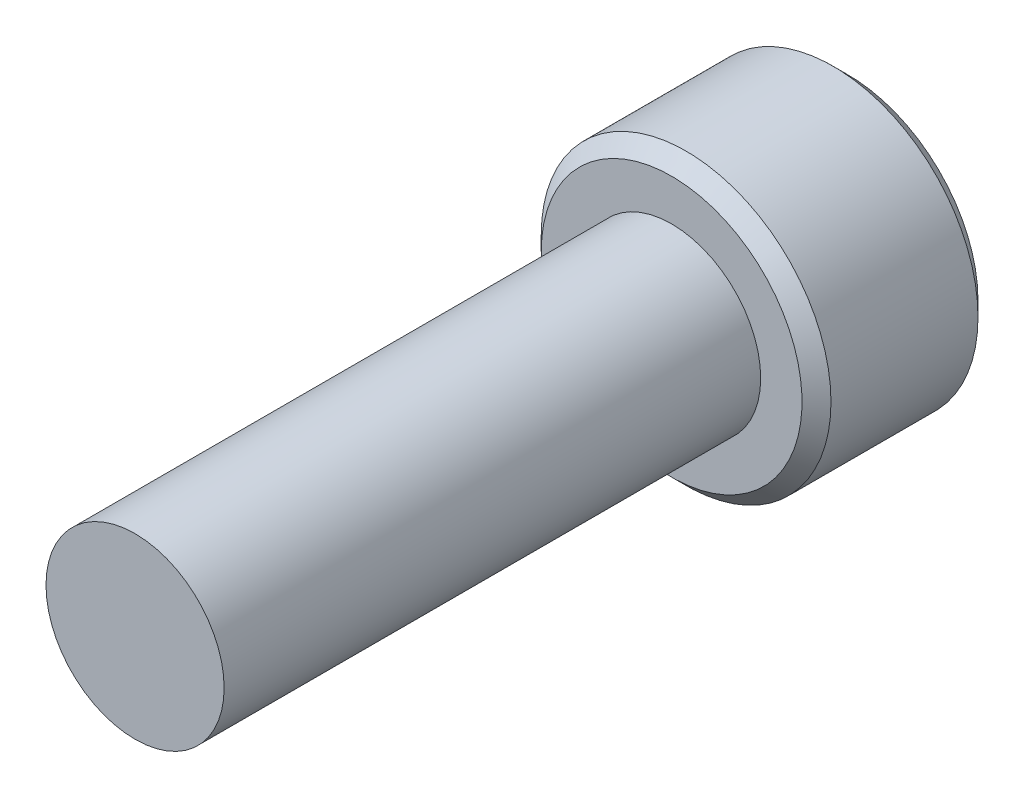
ISO-10303-21;
HEADER;
FILE_DESCRIPTION(('STEP AP214'),'2;1');
FILE_NAME('part.step','',(''),(''),'','','');
FILE_SCHEMA(('AUTOMOTIVE_DESIGN { 1 0 10303 214 1 1 1 1 }'));
ENDSEC;
DATA;
#1=APPLICATION_CONTEXT('core data for automotive mechanical design processes');
#2=APPLICATION_PROTOCOL_DEFINITION('international standard','automotive_design',2000,#1);
#3=PRODUCT_CONTEXT('',#1,'mechanical');
#4=PRODUCT('Part','Part','',(#3));
#5=PRODUCT_RELATED_PRODUCT_CATEGORY('part','',(#4));
#6=PRODUCT_DEFINITION_FORMATION('','',#4);
#7=PRODUCT_DEFINITION_CONTEXT('part definition',#1,'design');
#8=PRODUCT_DEFINITION('design','',#6,#7);
#9=PRODUCT_DEFINITION_SHAPE('','',#8);
#10=(LENGTH_UNIT() NAMED_UNIT(*) SI_UNIT(.MILLI.,.METRE.));
#11=(NAMED_UNIT(*) PLANE_ANGLE_UNIT() SI_UNIT($,.RADIAN.));
#12=(NAMED_UNIT(*) SI_UNIT($,.STERADIAN.) SOLID_ANGLE_UNIT());
#13=UNCERTAINTY_MEASURE_WITH_UNIT(LENGTH_MEASURE(1.E-05),#10,'distance_accuracy_value','');
#14=(GEOMETRIC_REPRESENTATION_CONTEXT(3) GLOBAL_UNCERTAINTY_ASSIGNED_CONTEXT((#13)) GLOBAL_UNIT_ASSIGNED_CONTEXT((#10,
#11,#12)) REPRESENTATION_CONTEXT('',''));
#15=CARTESIAN_POINT('',(0.,0.,0.));
#16=DIRECTION('',(0.,0.,1.));
#17=DIRECTION('',(1.,0.,0.));
#18=AXIS2_PLACEMENT_3D('',#15,#16,#17);
#19=CARTESIAN_POINT('',(1.7859375,1.03111149638096,-14.18669375));
#20=DIRECTION('',(1.,0.,0.));
#21=DIRECTION('',(0.,0.,-1.));
#22=AXIS2_PLACEMENT_3D('',#19,#20,#21);
#23=PLANE('',#22);
#24=CARTESIAN_POINT('',(1.7859375,-1.03111149637937,-16.8656000000012));
#25=CARTESIAN_POINT('',(1.78593750000005,-0.960694923078708,-16.8304245653045));
#26=CARTESIAN_POINT('',(1.78593750000003,-0.889108487066364,-16.7973030292043));
#27=CARTESIAN_POINT('',(1.78593749999997,-0.743109337852341,-16.7365905845436));
#28=CARTESIAN_POINT('',(1.78593749999995,-0.668681444315399,-16.7090365045877));
#29=CARTESIAN_POINT('',(1.78593750000005,-0.517674563664478,-16.6614565305802));
#30=CARTESIAN_POINT('',(1.78593750000018,-0.441103823281961,-16.641405158756));
#31=CARTESIAN_POINT('',(1.78593749999982,-0.286283782117742,-16.6105352050181));
#32=CARTESIAN_POINT('',(1.78593749999935,-0.208040449591477,-16.5996880720765));
#33=CARTESIAN_POINT('',(1.78593750000018,-0.107926669463274,-16.5924419923813));
#34=CARTESIAN_POINT('',(1.78593750000044,-0.0863521599569167,-16.5912705280223));
#35=CARTESIAN_POINT('',(1.78593749999956,-0.0431861080384684,-16.5897066436704));
#36=CARTESIAN_POINT('',(1.78593749999841,-0.0215945812637418,-16.5893138004778));
#37=CARTESIAN_POINT('',(1.78593749999653,0.0541981545623382,-16.5893162810781));
#38=CARTESIAN_POINT('',(1.78593749999905,0.108415549697237,-16.5917970707003));
#39=CARTESIAN_POINT('',(1.78593750000095,0.216427473854891,-16.6015728961233));
#40=CARTESIAN_POINT('',(1.78593750000033,0.270221681438319,-16.6088712897456));
#41=CARTESIAN_POINT('',(1.78593749999934,0.430887377453098,-16.637536606517));
#42=CARTESIAN_POINT('',(1.78593749999985,0.536587945955721,-16.6656688034959));
#43=CARTESIAN_POINT('',(1.7859375000001,0.707329338606865,-16.7232200323221));
#44=CARTESIAN_POINT('',(1.78593750000005,0.773761148804478,-16.7488111199169));
#45=CARTESIAN_POINT('',(1.78593749999995,0.904109359625222,-16.8042752636258));
#46=CARTESIAN_POINT('',(1.7859374999999,0.968043209878489,-16.8341070137323));
#47=CARTESIAN_POINT('',(1.7859375,1.03111149637934,-16.8656000000012));
#48=B_SPLINE_CURVE_WITH_KNOTS('',3,(#24,#25,#26,#27,#28,#29,#30,#31,#32,#33,#34,#35,#36,#37,#38,
#39,#40,#41,#42,#43,#44,#45,#46,#47),.UNSPECIFIED.,.F.,.F.,(4,2,2,2,2,2,2,2,2,2,2,4),(0.,
0.236303104653081,0.474121562186736,0.711124941864045,0.947390434622098,1.01219957256711,
1.07697347548168,1.23954324050254,1.40222643482151,1.72893676569651,1.94237217076301,
2.15385538568802),.UNSPECIFIED.);
#49=CARTESIAN_POINT('',(1.7859375,-1.03111149638017,-16.86560000003));
#50=VERTEX_POINT('',#49);
#51=CARTESIAN_POINT('',(1.78593749998182,1.03111149637042,-16.8656000000378));
#52=VERTEX_POINT('',#51);
#53=EDGE_CURVE('E20',#50,#52,#48,.T.);
#54=ORIENTED_EDGE('',*,*,#53,.F.);
#55=DIRECTION('',(0.,0.,1.));
#56=VECTOR('',#55,1.);
#57=CARTESIAN_POINT('',(1.7859375,-1.03111149638096,-14.18669375));
#58=LINE('',#57,#56);
#59=CARTESIAN_POINT('',(1.7859375,-1.03111149638096,-14.18669375));
#60=VERTEX_POINT('',#59);
#61=EDGE_CURVE('E82',#50,#60,#58,.T.);
#62=ORIENTED_EDGE('',*,*,#61,.T.);
#63=DIRECTION('',(0.,1.,0.));
#64=VECTOR('',#63,1.);
#65=CARTESIAN_POINT('',(1.7859375,3.09333448914288,-14.18669375));
#66=LINE('',#65,#64);
#67=CARTESIAN_POINT('',(1.78593749999995,1.03111149638087,-14.18669375));
#68=VERTEX_POINT('',#67);
#69=EDGE_CURVE('E85',#68,#60,#66,.F.);
#70=ORIENTED_EDGE('',*,*,#69,.F.);
#71=DIRECTION('',(0.,0.,1.));
#72=VECTOR('',#71,1.);
#73=CARTESIAN_POINT('',(1.78593749999992,1.03111149638082,-14.18669375));
#74=LINE('',#73,#72);
#75=EDGE_CURVE('E268',#68,#52,#74,.F.);
#76=ORIENTED_EDGE('',*,*,#75,.T.);
#77=EDGE_LOOP('',(#54,#62,#70,#76));
#78=FACE_BOUND('',#77,.T.);
#79=ADVANCED_FACE('F16',(#78),#23,.F.);
#80=CARTESIAN_POINT('',(-1.7859375,-1.03111149638096,-14.18669375));
#81=DIRECTION('',(-1.,0.,0.));
#82=DIRECTION('',(0.,0.,1.));
#83=AXIS2_PLACEMENT_3D('',#80,#81,#82);
#84=PLANE('',#83);
#85=CARTESIAN_POINT('',(-1.78593750000409,1.031111496355,-16.8656000000436));
#86=CARTESIAN_POINT('',(-1.78593750000151,0.960694923055193,-16.8304245653494));
#87=CARTESIAN_POINT('',(-1.78593750000041,0.88910848704405,-16.797303029251));
#88=CARTESIAN_POINT('',(-1.78593749999958,0.7431093378328,-16.7365905845932));
#89=CARTESIAN_POINT('',(-1.78593749999986,0.668681444297431,-16.7090365046383));
#90=CARTESIAN_POINT('',(-1.78593750000014,0.517674563649615,-16.6614565306329));
#91=CARTESIAN_POINT('',(-1.78593750000015,0.441103823268626,-16.6414051588097));
#92=CARTESIAN_POINT('',(-1.78593749999985,0.286283782107617,-16.6105352050734));
#93=CARTESIAN_POINT('',(-1.78593749999953,0.208040449583033,-16.5996880721323));
#94=CARTESIAN_POINT('',(-1.78593750000013,0.107926669457654,-16.5924419924378));
#95=CARTESIAN_POINT('',(-1.78593750000032,0.086352159952417,-16.591270528079));
#96=CARTESIAN_POINT('',(-1.78593749999968,0.0431861080362155,-16.5897066437272));
#97=CARTESIAN_POINT('',(-1.78593749999885,0.0215945812626152,-16.5893138005344));
#98=CARTESIAN_POINT('',(-1.7859374999975,-0.0541981545623212,-16.5893162811346));
#99=CARTESIAN_POINT('',(-1.78593749999932,-0.108415549697204,-16.591797070757));
#100=CARTESIAN_POINT('',(-1.78593750000068,-0.216427473854849,-16.6015728961803));
#101=CARTESIAN_POINT('',(-1.78593750000024,-0.270221681438286,-16.6088712898025));
#102=CARTESIAN_POINT('',(-1.78593749999952,-0.430887377453079,-16.6375366065738));
#103=CARTESIAN_POINT('',(-1.78593749999989,-0.536587945955707,-16.6656688035527));
#104=CARTESIAN_POINT('',(-1.78593750000007,-0.70732933860241,-16.7232200323774));
#105=CARTESIAN_POINT('',(-1.78593750000004,-0.773761148795714,-16.7488111199704));
#106=CARTESIAN_POINT('',(-1.78593749999996,-0.904109359608134,-16.804275263675));
#107=CARTESIAN_POINT('',(-1.78593749999993,-0.968043209857382,-16.8341070137791));
#108=CARTESIAN_POINT('',(-1.7859375,-1.03111149635433,-16.8656000000455));
#109=B_SPLINE_CURVE_WITH_KNOTS('',3,(#85,#86,#87,#88,#89,#90,#91,#92,#93,#94,#95,#96,#97,#98,
#99,#100,#101,#102,#103,#104,#105,#106,#107,#108),.UNSPECIFIED.,.F.,.F.,(4,2,2,2,2,2,2,2,2,2,2,
4),(0.,0.236303104647563,0.474121562175721,0.711124941847836,0.947390434600691,1.01219957254232,
1.07697347545353,1.23954324047434,1.40222643479334,1.72893676566835,1.9423721707208,
2.15385538563192),.UNSPECIFIED.);
#110=CARTESIAN_POINT('',(-1.78593749996372,1.03111149638848,-16.8656000000311));
#111=VERTEX_POINT('',#110);
#112=CARTESIAN_POINT('',(-1.78593749998182,-1.03111149637042,-16.8656000000378));
#113=VERTEX_POINT('',#112);
#114=EDGE_CURVE('E59',#111,#113,#109,.T.);
#115=ORIENTED_EDGE('',*,*,#114,.F.);
#116=DIRECTION('',(0.,0.,1.));
#117=VECTOR('',#116,1.);
#118=CARTESIAN_POINT('',(-1.7859375,1.03111149638096,-14.18669375));
#119=LINE('',#118,#117);
#120=CARTESIAN_POINT('',(-1.7859375,1.03111149638096,-14.18669375));
#121=VERTEX_POINT('',#120);
#122=EDGE_CURVE('E266',#111,#121,#119,.T.);
#123=ORIENTED_EDGE('',*,*,#122,.T.);
#124=DIRECTION('',(0.,1.,0.));
#125=VECTOR('',#124,1.);
#126=CARTESIAN_POINT('',(-1.7859375,3.09333448914288,-14.18669375));
#127=LINE('',#126,#125);
#128=CARTESIAN_POINT('',(-1.78593749999995,-1.03111149638087,-14.18669375));
#129=VERTEX_POINT('',#128);
#130=EDGE_CURVE('E99',#129,#121,#127,.T.);
#131=ORIENTED_EDGE('',*,*,#130,.F.);
#132=DIRECTION('',(0.,0.,1.));
#133=VECTOR('',#132,1.);
#134=CARTESIAN_POINT('',(-1.78593749999992,-1.03111149638082,-14.18669375));
#135=LINE('',#134,#133);
#136=EDGE_CURVE('E92',#129,#113,#135,.F.);
#137=ORIENTED_EDGE('',*,*,#136,.T.);
#138=EDGE_LOOP('',(#115,#123,#131,#137));
#139=FACE_BOUND('',#138,.T.);
#140=ADVANCED_FACE('F205',(#139),#84,.F.);
#141=CARTESIAN_POINT('',(1.7859375,3.09333448914288,-14.18669375));
#142=DIRECTION('',(0.,0.,-1.));
#143=DIRECTION('',(-1.,0.,0.));
#144=AXIS2_PLACEMENT_3D('',#141,#142,#143);
#145=PLANE('',#144);
#146=ORIENTED_EDGE('',*,*,#130,.T.);
#147=DIRECTION('',(-0.866025403784429,-0.500000000000017,0.));
#148=VECTOR('',#147,1.);
#149=CARTESIAN_POINT('',(-1.7859375,1.03111149638096,-14.18669375));
#150=LINE('',#149,#148);
#151=CARTESIAN_POINT('',(0.,2.06222299276178,-14.18669375));
#152=VERTEX_POINT('',#151);
#153=EDGE_CURVE('E68',#121,#152,#150,.F.);
#154=ORIENTED_EDGE('',*,*,#153,.T.);
#155=DIRECTION('',(-0.866025403784429,0.500000000000017,0.));
#156=VECTOR('',#155,1.);
#157=CARTESIAN_POINT('',(0.,2.06222299276167,-14.18669375));
#158=LINE('',#157,#156);
#159=EDGE_CURVE('E97',#152,#68,#158,.F.);
#160=ORIENTED_EDGE('',*,*,#159,.T.);
#161=ORIENTED_EDGE('',*,*,#69,.T.);
#162=DIRECTION('',(0.866025403784429,0.500000000000017,0.));
#163=VECTOR('',#162,1.);
#164=CARTESIAN_POINT('',(1.7859375,-1.03111149638096,-14.18669375));
#165=LINE('',#164,#163);
#166=CARTESIAN_POINT('',(0.,-2.06222299276178,-14.18669375));
#167=VERTEX_POINT('',#166);
#168=EDGE_CURVE('E91',#60,#167,#165,.F.);
#169=ORIENTED_EDGE('',*,*,#168,.T.);
#170=DIRECTION('',(0.866025403784429,-0.500000000000017,0.));
#171=VECTOR('',#170,1.);
#172=CARTESIAN_POINT('',(0.,-2.06222299276167,-14.18669375));
#173=LINE('',#172,#171);
#174=EDGE_CURVE('E279',#167,#129,#173,.F.);
#175=ORIENTED_EDGE('',*,*,#174,.T.);
#176=EDGE_LOOP('',(#146,#154,#160,#161,#169,#175));
#177=FACE_BOUND('',#176,.T.);
#178=ADVANCED_FACE('F94',(#177),#145,.T.);
#179=CARTESIAN_POINT('',(0.,-2.06222299276167,-14.18669375));
#180=DIRECTION('',(-0.500000000000017,-0.866025403784429,0.));
#181=DIRECTION('',(0.866025403784429,-0.500000000000017,0.));
#182=AXIS2_PLACEMENT_3D('',#179,#180,#181);
#183=PLANE('',#182);
#184=ORIENTED_EDGE('',*,*,#136,.F.);
#185=ORIENTED_EDGE('',*,*,#174,.F.);
#186=DIRECTION('',(0.,0.,1.));
#187=VECTOR('',#186,1.);
#188=CARTESIAN_POINT('',(0.,-2.06222299276181,-14.18669375));
#189=LINE('',#188,#187);
#190=CARTESIAN_POINT('',(0.,-2.06222299274083,-16.8656000000379));
#191=VERTEX_POINT('',#190);
#192=EDGE_CURVE('E103',#167,#191,#189,.F.);
#193=ORIENTED_EDGE('',*,*,#192,.T.);
#194=CARTESIAN_POINT('',(-2.52425246083631E-11,-2.06222299275114,-16.8656000000432));
#195=CARTESIAN_POINT('',(-0.0613835440644508,-2.0267831870737,-16.8301942051948));
#196=CARTESIAN_POINT('',(-0.123793422288812,-1.9907508270797,-16.7968681956716));
#197=CARTESIAN_POINT('',(-0.251053568630573,-1.91727714733139,-16.7358496949329));
#198=CARTESIAN_POINT('',(-0.315915932581498,-1.87982884404433,-16.7081911432972));
#199=CARTESIAN_POINT('',(-0.446707707791609,-1.80431617741919,-16.6608118581681));
#200=CARTESIAN_POINT('',(-0.512603828284567,-1.76627103451395,-16.6409720707712));
#201=CARTESIAN_POINT('',(-0.6458463698891,-1.68934341725101,-16.610405099807));
#202=CARTESIAN_POINT('',(-0.713188723557539,-1.65046329123269,-16.5996551077041));
#203=CARTESIAN_POINT('',(-0.829256370751006,-1.58345160388134,-16.5899555846295));
#204=CARTESIAN_POINT('',(-0.877831821101637,-1.5554065545454,-16.5885201744524));
#205=CARTESIAN_POINT('',(-0.974903249059068,-1.49936233948355,-16.5909415301668));
#206=CARTESIAN_POINT('',(-1.02339919284593,-1.47136319328359,-16.5948001510132));
#207=CARTESIAN_POINT('',(-1.11991972029757,-1.41563704077706,-16.6075882036147));
#208=CARTESIAN_POINT('',(-1.16794387251252,-1.38791028356816,-16.6165219039302));
#209=CARTESIAN_POINT('',(-1.26318834669003,-1.33292086076295,-16.6389751790974));
#210=CARTESIAN_POINT('',(-1.31040827497174,-1.30565842245839,-16.6524969357525));
#211=CARTESIAN_POINT('',(-1.43130969041198,-1.23585595770855,-16.6926243108538));
#212=CARTESIAN_POINT('',(-1.50424262479197,-1.19374810841147,-16.7222499206904));
#213=CARTESIAN_POINT('',(-1.61148491151358,-1.13183174530424,-16.7722605683855));
#214=CARTESIAN_POINT('',(-1.64682614895389,-1.11142747235458,-16.7898317844474));
#215=CARTESIAN_POINT('',(-1.71685424556421,-1.07099673192577,-16.8265757307161));
#216=CARTESIAN_POINT('',(-1.75154149001672,-1.05097004200367,-16.8457474794197));
#217=CARTESIAN_POINT('',(-1.785937499977,-1.03111149639405,-16.8656000000454));
#218=B_SPLINE_CURVE_WITH_KNOTS('',3,(#194,#195,#196,#197,#198,#199,#200,#201,#202,#203,#204,
#205,#206,#207,#208,#209,#210,#211,#212,#213,#214,#215,#216,#217),.UNSPECIFIED.,.F.,.F.,(4,2,2,
2,2,2,2,2,2,2,2,4),(0.,0.237856418652743,0.477098096699965,0.712541425839908,0.947392201526387,
1.11547935100692,1.28362541093116,1.45191310539068,1.62028093976164,1.88754436619542,
2.02081355604781,2.1540016125347),.UNSPECIFIED.);
#219=EDGE_CURVE('E189',#191,#113,#218,.T.);
#220=ORIENTED_EDGE('',*,*,#219,.T.);
#221=EDGE_LOOP('',(#184,#185,#193,#220));
#222=FACE_BOUND('',#221,.T.);
#223=ADVANCED_FACE('F198',(#222),#183,.F.);
#224=CARTESIAN_POINT('',(1.7859375,-1.03111149638096,-14.18669375));
#225=DIRECTION('',(0.500000000000017,-0.866025403784429,0.));
#226=DIRECTION('',(0.866025403784429,0.500000000000017,0.));
#227=AXIS2_PLACEMENT_3D('',#224,#225,#226);
#228=PLANE('',#227);
#229=ORIENTED_EDGE('',*,*,#192,.F.);
#230=ORIENTED_EDGE('',*,*,#168,.F.);
#231=ORIENTED_EDGE('',*,*,#61,.F.);
#232=CARTESIAN_POINT('',(1.78593749998766,-1.0311114964027,-16.8656000000411));
#233=CARTESIAN_POINT('',(1.72455395594179,-1.06655130207204,-16.8301942051949));
#234=CARTESIAN_POINT('',(1.66214407771442,-1.10258366206286,-16.7968681956725));
#235=CARTESIAN_POINT('',(1.53488393136976,-1.17605734180923,-16.7358496949339));
#236=CARTESIAN_POINT('',(1.47002156741897,-1.21350564509754,-16.7081911432977));
#237=CARTESIAN_POINT('',(1.33922979220818,-1.28901831172403,-16.660811858168));
#238=CARTESIAN_POINT('',(1.27333367171441,-1.32706345462939,-16.6409720707709));
#239=CARTESIAN_POINT('',(1.1400911301085,-1.40399107189288,-16.6104050998067));
#240=CARTESIAN_POINT('',(1.07274877643948,-1.44287119791163,-16.5996551077038));
#241=CARTESIAN_POINT('',(0.956681129245291,-1.50988288526344,-16.5899555846294));
#242=CARTESIAN_POINT('',(0.908105678894523,-1.53792793459945,-16.5885201744525));
#243=CARTESIAN_POINT('',(0.811034250936835,-1.59397214966144,-16.5909415301672));
#244=CARTESIAN_POINT('',(0.762538307149846,-1.62197129586147,-16.5948001510138));
#245=CARTESIAN_POINT('',(0.666017779697999,-1.67769744836812,-16.6075882036156));
#246=CARTESIAN_POINT('',(0.617993627482958,-1.70542420557708,-16.6165219039313));
#247=CARTESIAN_POINT('',(0.522749153305281,-1.76041362838239,-16.6389751790989));
#248=CARTESIAN_POINT('',(0.475529225023498,-1.78767606668699,-16.6524969357541));
#249=CARTESIAN_POINT('',(0.354627809584243,-1.85747853143625,-16.6926243108555));
#250=CARTESIAN_POINT('',(0.281694875205298,-1.89958638073273,-16.7222499206918));
#251=CARTESIAN_POINT('',(0.174452588485172,-1.96150274383911,-16.7722605683863));
#252=CARTESIAN_POINT('',(0.139111351045339,-1.98190701678849,-16.789831784448));
#253=CARTESIAN_POINT('',(0.0690832544359493,-2.02233775721676,-16.8265757307162));
#254=CARTESIAN_POINT('',(0.0343960099838948,-2.0423644471386,-16.8457474794195));
#255=CARTESIAN_POINT('',(2.40634388265502E-11,-2.06222299274796,-16.865600000045));
#256=B_SPLINE_CURVE_WITH_KNOTS('',3,(#232,#233,#234,#235,#236,#237,#238,#239,#240,#241,#242,
#243,#244,#245,#246,#247,#248,#249,#250,#251,#252,#253,#254,#255),.UNSPECIFIED.,.F.,.F.,(4,2,2,
2,2,2,2,2,2,2,2,4),(0.,0.237856418654608,0.477098096703912,0.712541425846054,0.94739220153464,
1.1154793510156,1.28362541094031,1.45191310540021,1.62028093977156,1.88754436620169,
2.02081355605231,2.15400161253744),.UNSPECIFIED.);
#257=EDGE_CURVE('E182',#50,#191,#256,.T.);
#258=ORIENTED_EDGE('',*,*,#257,.T.);
#259=EDGE_LOOP('',(#229,#230,#231,#258));
#260=FACE_BOUND('',#259,.T.);
#261=ADVANCED_FACE('F102',(#260),#228,.F.);
#262=CARTESIAN_POINT('',(0.,2.06222299276167,-14.18669375));
#263=DIRECTION('',(0.500000000000017,0.866025403784429,0.));
#264=DIRECTION('',(-0.866025403784429,0.500000000000017,0.));
#265=AXIS2_PLACEMENT_3D('',#262,#263,#264);
#266=PLANE('',#265);
#267=ORIENTED_EDGE('',*,*,#75,.F.);
#268=ORIENTED_EDGE('',*,*,#159,.F.);
#269=DIRECTION('',(0.,0.,1.));
#270=VECTOR('',#269,1.);
#271=CARTESIAN_POINT('',(0.,2.06222299276181,-14.18669375));
#272=LINE('',#271,#270);
#273=CARTESIAN_POINT('',(0.,2.06222299274083,-16.8656000000379));
#274=VERTEX_POINT('',#273);
#275=EDGE_CURVE('E40',#152,#274,#272,.F.);
#276=ORIENTED_EDGE('',*,*,#275,.T.);
#277=CARTESIAN_POINT('',(2.5242462771058E-11,2.06222299275114,-16.8656000000432));
#278=CARTESIAN_POINT('',(0.0613835440644523,2.0267831870737,-16.8301942051948));
#279=CARTESIAN_POINT('',(0.123793422288815,1.9907508270797,-16.7968681956716));
#280=CARTESIAN_POINT('',(0.251053568630583,1.91727714733138,-16.7358496949329));
#281=CARTESIAN_POINT('',(0.31591593258151,1.87982884404433,-16.7081911432972));
#282=CARTESIAN_POINT('',(0.446707707791621,1.80431617741918,-16.6608118581681));
#283=CARTESIAN_POINT('',(0.512603828284577,1.76627103451395,-16.6409720707712));
#284=CARTESIAN_POINT('',(0.645846369889104,1.68934341725101,-16.610405099807));
#285=CARTESIAN_POINT('',(0.713188723557541,1.65046329123269,-16.5996551077041));
#286=CARTESIAN_POINT('',(0.829256370751005,1.58345160388134,-16.5899555846295));
#287=CARTESIAN_POINT('',(0.877831821101636,1.5554065545454,-16.5885201744524));
#288=CARTESIAN_POINT('',(0.974903249059065,1.49936233948355,-16.5909415301668));
#289=CARTESIAN_POINT('',(1.02339919284593,1.4713631932836,-16.5948001510132));
#290=CARTESIAN_POINT('',(1.11991972029757,1.41563704077707,-16.6075882036147));
#291=CARTESIAN_POINT('',(1.16794387251252,1.38791028356816,-16.6165219039302));
#292=CARTESIAN_POINT('',(1.26318834669003,1.33292086076295,-16.6389751790974));
#293=CARTESIAN_POINT('',(1.31040827497174,1.30565842245839,-16.6524969357525));
#294=CARTESIAN_POINT('',(1.43130969041249,1.23585595770826,-16.692624310854));
#295=CARTESIAN_POINT('',(1.50424262479296,1.19374810841091,-16.7222499206908));
#296=CARTESIAN_POINT('',(1.61148491151526,1.13183174530327,-16.7722605683863));
#297=CARTESIAN_POINT('',(1.6468261489558,1.11142747235348,-16.7898317844484));
#298=CARTESIAN_POINT('',(1.71685424556657,1.07099673192441,-16.8265757307173));
#299=CARTESIAN_POINT('',(1.7515414900193,1.05097004200218,-16.8457474794211));
#300=CARTESIAN_POINT('',(1.7859374999798,1.03111149639244,-16.865600000047));
#301=B_SPLINE_CURVE_WITH_KNOTS('',3,(#277,#278,#279,#280,#281,#282,#283,#284,#285,#286,#287,
#288,#289,#290,#291,#292,#293,#294,#295,#296,#297,#298,#299,#300),.UNSPECIFIED.,.F.,.F.,(4,2,2,
2,2,2,2,2,2,2,2,4),(0.,0.237856418652751,0.477098096699982,0.712541425839917,0.947392201526388,
1.11547935100691,1.28362541093116,1.45191310539068,1.62028093976164,1.88754436619723,
2.02081355605051,2.1540016125383),.UNSPECIFIED.);
#302=EDGE_CURVE('E148',#274,#52,#301,.T.);
#303=ORIENTED_EDGE('',*,*,#302,.T.);
#304=EDGE_LOOP('',(#267,#268,#276,#303));
#305=FACE_BOUND('',#304,.T.);
#306=ADVANCED_FACE('F197',(#305),#266,.F.);
#307=CARTESIAN_POINT('',(-1.7859375,1.03111149638096,-14.18669375));
#308=DIRECTION('',(-0.500000000000017,0.866025403784429,0.));
#309=DIRECTION('',(-0.866025403784429,-0.500000000000017,0.));
#310=AXIS2_PLACEMENT_3D('',#307,#308,#309);
#311=PLANE('',#310);
#312=ORIENTED_EDGE('',*,*,#275,.F.);
#313=ORIENTED_EDGE('',*,*,#153,.F.);
#314=ORIENTED_EDGE('',*,*,#122,.F.);
#315=CARTESIAN_POINT('',(-1.78593749997956,1.03111149639748,-16.8656000000436));
#316=CARTESIAN_POINT('',(-1.72455395593779,1.06655130207079,-16.8301942051953));
#317=CARTESIAN_POINT('',(-1.66214407771234,1.1025836620631,-16.7968681956721));
#318=CARTESIAN_POINT('',(-1.53488393136968,1.17605734181024,-16.7358496949333));
#319=CARTESIAN_POINT('',(-1.47002156741896,1.2135056450978,-16.7081911432976));
#320=CARTESIAN_POINT('',(-1.33922979220889,1.28901831172337,-16.6608118581684));
#321=CARTESIAN_POINT('',(-1.27333367171577,1.32706345462854,-16.6409720707714));
#322=CARTESIAN_POINT('',(-1.14009113011102,1.40399107189149,-16.6104050998071));
#323=CARTESIAN_POINT('',(-1.07274877644251,1.44287119790989,-16.5996551077043));
#324=CARTESIAN_POINT('',(-0.956681129248954,1.50988288526131,-16.5899555846296));
#325=CARTESIAN_POINT('',(-0.908105678898305,1.53792793459727,-16.5885201744526));
#326=CARTESIAN_POINT('',(-0.811034250940843,1.59397214965913,-16.590941530167));
#327=CARTESIAN_POINT('',(-0.762538307153963,1.62197129585909,-16.5948001510134));
#328=CARTESIAN_POINT('',(-0.666017779702301,1.67769744836564,-16.6075882036149));
#329=CARTESIAN_POINT('',(-0.617993627487339,1.70542420557455,-16.6165219039304));
#330=CARTESIAN_POINT('',(-0.522749153309807,1.76041362837977,-16.6389751790977));
#331=CARTESIAN_POINT('',(-0.475529225028091,1.78767606668434,-16.6524969357527));
#332=CARTESIAN_POINT('',(-0.354627809588058,1.85747853143405,-16.692624310854));
#333=CARTESIAN_POINT('',(-0.281694875208293,1.899586380731,-16.7222499206905));
#334=CARTESIAN_POINT('',(-0.174452588486997,1.96150274383805,-16.7722605683854));
#335=CARTESIAN_POINT('',(-0.139111351046789,1.98190701678765,-16.7898317844473));
#336=CARTESIAN_POINT('',(-0.069083254436664,2.02233775721635,-16.8265757307158));
#337=CARTESIAN_POINT('',(-0.0343960099842489,2.0423644471384,-16.8457474794193));
#338=CARTESIAN_POINT('',(-2.4063409999261E-11,2.06222299274796,-16.865600000045));
#339=B_SPLINE_CURVE_WITH_KNOTS('',3,(#315,#316,#317,#318,#319,#320,#321,#322,#323,#324,#325,
#326,#327,#328,#329,#330,#331,#332,#333,#334,#335,#336,#337,#338),.UNSPECIFIED.,.F.,.F.,(4,2,2,
2,2,2,2,2,2,2,2,4),(0.,0.23785641865302,0.477098096700542,0.712541425840793,0.94739220152757,
1.11547935100815,1.28362541093245,1.45191310539201,1.620280939763,1.88754436619598,
2.02081355604798,2.15400161253447),.UNSPECIFIED.);
#340=EDGE_CURVE('E140',#111,#274,#339,.T.);
#341=ORIENTED_EDGE('',*,*,#340,.T.);
#342=EDGE_LOOP('',(#312,#313,#314,#341));
#343=FACE_BOUND('',#342,.T.);
#344=ADVANCED_FACE('F156',(#343),#311,.F.);
#345=CARTESIAN_POINT('',(0.,0.,-16.8656000000169));
#346=DIRECTION('',(0.,0.,-1.));
#347=DIRECTION('',(-1.,0.,0.));
#348=AXIS2_PLACEMENT_3D('',#345,#346,#347);
#349=CONICAL_SURFACE('',#348,2.06222299271985,0.785398163397448);
#350=CARTESIAN_POINT('',(0.,0.,-16.8656000000169));
#351=DIRECTION('',(0.,0.,-1.));
#352=DIRECTION('',(-1.,0.,0.));
#353=AXIS2_PLACEMENT_3D('',#350,#351,#352);
#354=CIRCLE('',#353,2.06222299271985);
#355=EDGE_CURVE('E137',#111,#113,#354,.F.);
#356=ORIENTED_EDGE('',*,*,#355,.F.);
#357=ORIENTED_EDGE('',*,*,#114,.T.);
#358=EDGE_LOOP('',(#356,#357));
#359=FACE_BOUND('',#358,.T.);
#360=ADVANCED_FACE('F212',(#359),#349,.F.);
#361=CARTESIAN_POINT('',(0.,0.,-16.8656000000169));
#362=DIRECTION('',(0.,0.,-1.));
#363=DIRECTION('',(-1.,0.,0.));
#364=AXIS2_PLACEMENT_3D('',#361,#362,#363);
#365=CONICAL_SURFACE('',#364,2.06222299271985,0.785398163397448);
#366=CARTESIAN_POINT('',(0.,0.,-16.8656000000169));
#367=DIRECTION('',(0.,0.,-1.));
#368=DIRECTION('',(-1.,0.,0.));
#369=AXIS2_PLACEMENT_3D('',#366,#367,#368);
#370=CIRCLE('',#369,2.06222299271985);
#371=EDGE_CURVE('E134',#113,#191,#370,.F.);
#372=ORIENTED_EDGE('',*,*,#371,.F.);
#373=ORIENTED_EDGE('',*,*,#219,.F.);
#374=EDGE_LOOP('',(#372,#373));
#375=FACE_BOUND('',#374,.T.);
#376=ADVANCED_FACE('F179',(#375),#365,.F.);
#377=CARTESIAN_POINT('',(0.,0.,-16.8656000000169));
#378=DIRECTION('',(0.,0.,-1.));
#379=DIRECTION('',(-1.,0.,0.));
#380=AXIS2_PLACEMENT_3D('',#377,#378,#379);
#381=CONICAL_SURFACE('',#380,2.06222299271985,0.785398163397448);
#382=CARTESIAN_POINT('',(0.,0.,-16.8656000000169));
#383=DIRECTION('',(0.,0.,-1.));
#384=DIRECTION('',(-1.,0.,0.));
#385=AXIS2_PLACEMENT_3D('',#382,#383,#384);
#386=CIRCLE('',#385,2.06222299271985);
#387=EDGE_CURVE('E131',#191,#50,#386,.F.);
#388=ORIENTED_EDGE('',*,*,#387,.F.);
#389=ORIENTED_EDGE('',*,*,#257,.F.);
#390=EDGE_LOOP('',(#388,#389));
#391=FACE_BOUND('',#390,.T.);
#392=ADVANCED_FACE('F174',(#391),#381,.F.);
#393=CARTESIAN_POINT('',(0.,0.,-16.8656000000169));
#394=DIRECTION('',(0.,0.,-1.));
#395=DIRECTION('',(-1.,0.,0.));
#396=AXIS2_PLACEMENT_3D('',#393,#394,#395);
#397=CONICAL_SURFACE('',#396,2.0622229927767,0.785398163397448);
#398=CARTESIAN_POINT('',(0.,0.,-16.8656000000169));
#399=DIRECTION('',(0.,0.,-1.));
#400=DIRECTION('',(-1.,0.,0.));
#401=AXIS2_PLACEMENT_3D('',#398,#399,#400);
#402=CIRCLE('',#401,2.0622229927767);
#403=EDGE_CURVE('E128',#50,#52,#402,.F.);
#404=ORIENTED_EDGE('',*,*,#403,.F.);
#405=ORIENTED_EDGE('',*,*,#53,.T.);
#406=EDGE_LOOP('',(#404,#405));
#407=FACE_BOUND('',#406,.T.);
#408=ADVANCED_FACE('F169',(#407),#397,.F.);
#409=CARTESIAN_POINT('',(0.,0.,-16.8656000000169));
#410=DIRECTION('',(0.,0.,-1.));
#411=DIRECTION('',(-1.,0.,0.));
#412=AXIS2_PLACEMENT_3D('',#409,#410,#411);
#413=CONICAL_SURFACE('',#412,2.06222299271985,0.785398163397448);
#414=CARTESIAN_POINT('',(0.,0.,-16.8656000000169));
#415=DIRECTION('',(0.,0.,-1.));
#416=DIRECTION('',(-1.,0.,0.));
#417=AXIS2_PLACEMENT_3D('',#414,#415,#416);
#418=CIRCLE('',#417,2.06222299271985);
#419=EDGE_CURVE('E125',#52,#274,#418,.F.);
#420=ORIENTED_EDGE('',*,*,#419,.F.);
#421=ORIENTED_EDGE('',*,*,#302,.F.);
#422=EDGE_LOOP('',(#420,#421));
#423=FACE_BOUND('',#422,.T.);
#424=ADVANCED_FACE('F164',(#423),#413,.F.);
#425=CARTESIAN_POINT('',(0.,0.,-16.8656000000169));
#426=DIRECTION('',(0.,0.,-1.));
#427=DIRECTION('',(-1.,0.,0.));
#428=AXIS2_PLACEMENT_3D('',#425,#426,#427);
#429=CONICAL_SURFACE('',#428,2.06222299271985,0.785398163397448);
#430=CARTESIAN_POINT('',(0.,0.,-16.8656000000169));
#431=DIRECTION('',(0.,0.,-1.));
#432=DIRECTION('',(-1.,0.,0.));
#433=AXIS2_PLACEMENT_3D('',#430,#431,#432);
#434=CIRCLE('',#433,2.06222299271985);
#435=EDGE_CURVE('E122',#274,#111,#434,.F.);
#436=ORIENTED_EDGE('',*,*,#435,.F.);
#437=ORIENTED_EDGE('',*,*,#340,.F.);
#438=EDGE_LOOP('',(#436,#437));
#439=FACE_BOUND('',#438,.T.);
#440=ADVANCED_FACE('F159',(#439),#429,.F.);
#441=CARTESIAN_POINT('',(0.,0.,-16.8656));
#442=DIRECTION('',(0.,0.,-1.));
#443=DIRECTION('',(-1.,0.,0.));
#444=AXIS2_PLACEMENT_3D('',#441,#442,#443);
#445=PLANE('',#444);
#446=ORIENTED_EDGE('',*,*,#419,.T.);
#447=ORIENTED_EDGE('',*,*,#435,.T.);
#448=ORIENTED_EDGE('',*,*,#355,.T.);
#449=ORIENTED_EDGE('',*,*,#371,.T.);
#450=ORIENTED_EDGE('',*,*,#387,.T.);
#451=ORIENTED_EDGE('',*,*,#403,.T.);
#452=EDGE_LOOP('',(#446,#447,#448,#449,#450,#451));
#453=FACE_BOUND('',#452,.T.);
#454=CARTESIAN_POINT('',(0.,0.,-16.8655999999601));
#455=DIRECTION('',(0.,0.,1.));
#456=DIRECTION('',(1.,0.,0.));
#457=AXIS2_PLACEMENT_3D('',#454,#455,#456);
#458=CIRCLE('',#457,3.08609999996179);
#459=CARTESIAN_POINT('',(3.08609999996179,0.,-16.8655999999601));
#460=VERTEX_POINT('',#459);
#461=EDGE_CURVE('E118',#460,#460,#458,.T.);
#462=ORIENTED_EDGE('',*,*,#461,.F.);
#463=EDGE_LOOP('',(#462));
#464=FACE_BOUND('',#463,.T.);
#465=ADVANCED_FACE('F163',(#453,#464),#445,.T.);
#466=CARTESIAN_POINT('',(0.,0.,-16.5227000000527));
#467=DIRECTION('',(0.,0.,1.));
#468=DIRECTION('',(1.,0.,0.));
#469=AXIS2_PLACEMENT_3D('',#466,#467,#468);
#470=CONICAL_SURFACE('',#469,3.42899999986912,0.785398163397448);
#471=CARTESIAN_POINT('',(0.,0.,-16.5227));
#472=DIRECTION('',(0.,0.,1.));
#473=DIRECTION('',(1.,0.,0.));
#474=AXIS2_PLACEMENT_3D('',#471,#472,#473);
#475=CIRCLE('',#474,3.429);
#476=CARTESIAN_POINT('',(3.429,0.,-16.5227));
#477=VERTEX_POINT('',#476);
#478=EDGE_CURVE('E121',#477,#477,#475,.T.);
#479=ORIENTED_EDGE('',*,*,#478,.F.);
#480=EDGE_LOOP('',(#479));
#481=FACE_BOUND('',#480,.T.);
#482=ORIENTED_EDGE('',*,*,#461,.T.);
#483=EDGE_LOOP('',(#482));
#484=FACE_BOUND('',#483,.T.);
#485=ADVANCED_FACE('F245',(#481,#484),#470,.T.);
#486=CARTESIAN_POINT('',(0.,0.,-16.8656));
#487=DIRECTION('',(0.,0.,1.));
#488=DIRECTION('',(1.,0.,0.));
#489=AXIS2_PLACEMENT_3D('',#486,#487,#488);
#490=CYLINDRICAL_SURFACE('',#489,3.429);
#491=CARTESIAN_POINT('',(0.,0.,-13.0429000000163));
#492=DIRECTION('',(0.,0.,-1.));
#493=DIRECTION('',(-1.,0.,0.));
#494=AXIS2_PLACEMENT_3D('',#491,#492,#493);
#495=CIRCLE('',#494,3.42899999998281);
#496=CARTESIAN_POINT('',(-3.42899999998281,0.,-13.0429000000163));
#497=VERTEX_POINT('',#496);
#498=EDGE_CURVE('E117',#497,#497,#495,.F.);
#499=ORIENTED_EDGE('',*,*,#498,.F.);
#500=EDGE_LOOP('',(#499));
#501=FACE_BOUND('',#500,.T.);
#502=ORIENTED_EDGE('',*,*,#478,.T.);
#503=EDGE_LOOP('',(#502));
#504=FACE_BOUND('',#503,.T.);
#505=ADVANCED_FACE('F242',(#501,#504),#490,.T.);
#506=CARTESIAN_POINT('',(0.,0.,-13.0428999999026));
#507=DIRECTION('',(0.,0.,-1.));
#508=DIRECTION('',(-1.,0.,0.));
#509=AXIS2_PLACEMENT_3D('',#506,#507,#508);
#510=CONICAL_SURFACE('',#509,3.42899999992596,0.785398163480335);
#511=ORIENTED_EDGE('',*,*,#498,.T.);
#512=EDGE_LOOP('',(#511));
#513=FACE_BOUND('',#512,.T.);
#514=CARTESIAN_POINT('',(0.,0.,-12.6999999999953));
#515=DIRECTION('',(0.,0.,-1.));
#516=DIRECTION('',(-1.,0.,0.));
#517=AXIS2_PLACEMENT_3D('',#514,#515,#516);
#518=CIRCLE('',#517,3.08609999996179);
#519=CARTESIAN_POINT('',(-3.08609999996179,0.,-12.6999999999953));
#520=VERTEX_POINT('',#519);
#521=EDGE_CURVE('E114',#520,#520,#518,.T.);
#522=ORIENTED_EDGE('',*,*,#521,.T.);
#523=EDGE_LOOP('',(#522));
#524=FACE_BOUND('',#523,.T.);
#525=ADVANCED_FACE('F238',(#513,#524),#510,.T.);
#526=CARTESIAN_POINT('',(0.,0.,0.));
#527=DIRECTION('',(0.,0.,1.));
#528=DIRECTION('',(1.,0.,0.));
#529=AXIS2_PLACEMENT_3D('',#526,#527,#528);
#530=PLANE('',#529);
#531=CARTESIAN_POINT('',(0.,0.,0.));
#532=DIRECTION('',(0.,0.,1.));
#533=DIRECTION('',(1.,0.,0.));
#534=AXIS2_PLACEMENT_3D('',#531,#532,#533);
#535=CIRCLE('',#534,2.1082);
#536=CARTESIAN_POINT('',(2.1082,0.,0.));
#537=VERTEX_POINT('',#536);
#538=EDGE_CURVE('E31',#537,#537,#535,.F.);
#539=ORIENTED_EDGE('',*,*,#538,.F.);
#540=EDGE_LOOP('',(#539));
#541=FACE_BOUND('',#540,.T.);
#542=ADVANCED_FACE('F231',(#541),#530,.T.);
#543=CARTESIAN_POINT('',(0.,0.,-12.7));
#544=DIRECTION('',(0.,0.,-1.));
#545=DIRECTION('',(-1.,0.,0.));
#546=AXIS2_PLACEMENT_3D('',#543,#544,#545);
#547=PLANE('',#546);
#548=CARTESIAN_POINT('',(0.,0.,-12.7));
#549=DIRECTION('',(0.,0.,1.));
#550=DIRECTION('',(1.,0.,0.));
#551=AXIS2_PLACEMENT_3D('',#548,#549,#550);
#552=CIRCLE('',#551,2.1082);
#553=CARTESIAN_POINT('',(2.1082,0.,-12.7));
#554=VERTEX_POINT('',#553);
#555=EDGE_CURVE('E11',#554,#554,#552,.T.);
#556=ORIENTED_EDGE('',*,*,#555,.F.);
#557=EDGE_LOOP('',(#556));
#558=FACE_BOUND('',#557,.T.);
#559=ORIENTED_EDGE('',*,*,#521,.F.);
#560=EDGE_LOOP('',(#559));
#561=FACE_BOUND('',#560,.T.);
#562=ADVANCED_FACE('F225',(#558,#561),#547,.F.);
#563=CARTESIAN_POINT('',(0.,0.,0.));
#564=DIRECTION('',(0.,0.,1.));
#565=DIRECTION('',(1.,0.,0.));
#566=AXIS2_PLACEMENT_3D('',#563,#564,#565);
#567=CYLINDRICAL_SURFACE('',#566,2.1082);
#568=ORIENTED_EDGE('',*,*,#538,.T.);
#569=EDGE_LOOP('',(#568));
#570=FACE_BOUND('',#569,.T.);
#571=ORIENTED_EDGE('',*,*,#555,.T.);
#572=EDGE_LOOP('',(#571));
#573=FACE_BOUND('',#572,.T.);
#574=ADVANCED_FACE('F223',(#570,#573),#567,.T.);
#575=CLOSED_SHELL('',(#79,#140,#178,#223,#261,#306,#344,#360,#376,#392,#408,#424,#440,#465,#485,
#505,#525,#542,#562,#574));
#576=MANIFOLD_SOLID_BREP('B1',#575);
#577=ADVANCED_BREP_SHAPE_REPRESENTATION('',(#18,#576),#14);
#578=SHAPE_DEFINITION_REPRESENTATION(#9,#577);
ENDSEC;
END-ISO-10303-21;
